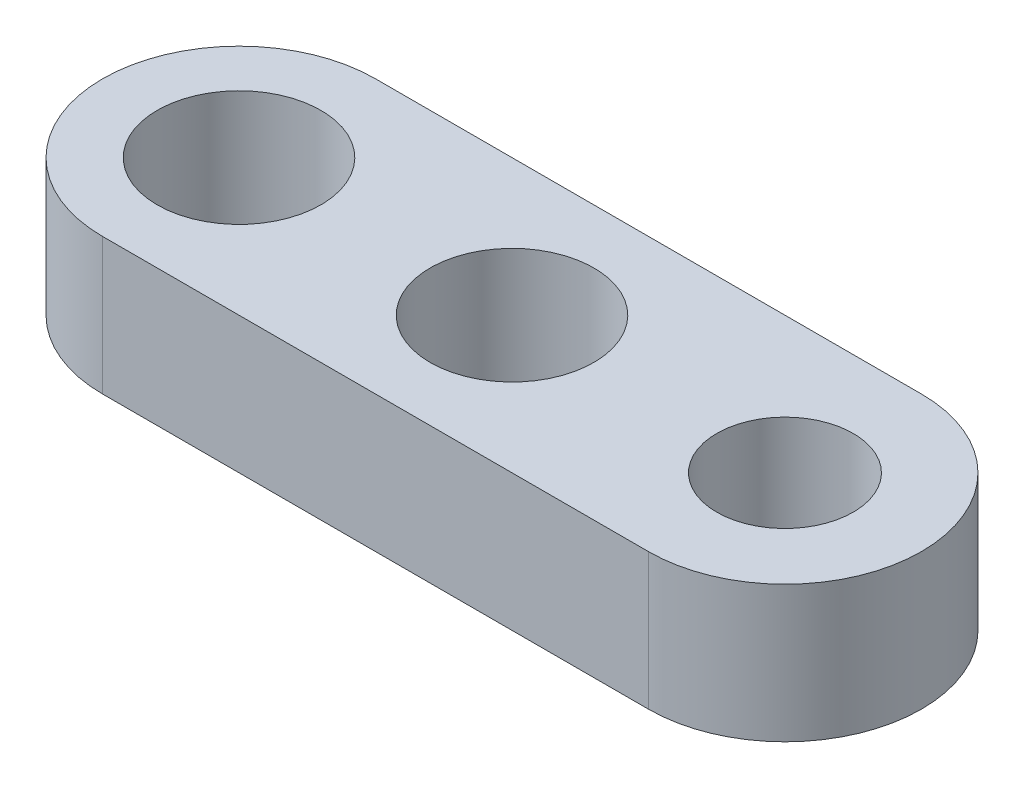
ISO-10303-21;
HEADER;
FILE_DESCRIPTION(('STEP AP214'),'2;1');
FILE_NAME('part.step','',(''),(''),'','','');
FILE_SCHEMA(('AUTOMOTIVE_DESIGN { 1 0 10303 214 1 1 1 1 }'));
ENDSEC;
DATA;
#1=APPLICATION_CONTEXT('core data for automotive mechanical design processes');
#2=APPLICATION_PROTOCOL_DEFINITION('international standard','automotive_design',2000,#1);
#3=PRODUCT_CONTEXT('',#1,'mechanical');
#4=PRODUCT('Part','Part','',(#3));
#5=PRODUCT_RELATED_PRODUCT_CATEGORY('part','',(#4));
#6=PRODUCT_DEFINITION_FORMATION('','',#4);
#7=PRODUCT_DEFINITION_CONTEXT('part definition',#1,'design');
#8=PRODUCT_DEFINITION('design','',#6,#7);
#9=PRODUCT_DEFINITION_SHAPE('','',#8);
#10=(LENGTH_UNIT() NAMED_UNIT(*) SI_UNIT(.MILLI.,.METRE.));
#11=(NAMED_UNIT(*) PLANE_ANGLE_UNIT() SI_UNIT($,.RADIAN.));
#12=(NAMED_UNIT(*) SI_UNIT($,.STERADIAN.) SOLID_ANGLE_UNIT());
#13=UNCERTAINTY_MEASURE_WITH_UNIT(LENGTH_MEASURE(1.E-05),#10,'distance_accuracy_value','');
#14=(GEOMETRIC_REPRESENTATION_CONTEXT(3) GLOBAL_UNCERTAINTY_ASSIGNED_CONTEXT((#13)) GLOBAL_UNIT_ASSIGNED_CONTEXT((#10,
#11,#12)) REPRESENTATION_CONTEXT('',''));
#15=CARTESIAN_POINT('',(0.,0.,0.));
#16=DIRECTION('',(0.,0.,1.));
#17=DIRECTION('',(1.,0.,0.));
#18=AXIS2_PLACEMENT_3D('',#15,#16,#17);
#19=CARTESIAN_POINT('',(0.,5.,0.));
#20=DIRECTION('',(0.,1.,0.));
#21=DIRECTION('',(0.,0.,1.));
#22=AXIS2_PLACEMENT_3D('',#19,#20,#21);
#23=PLANE('',#22);
#24=CARTESIAN_POINT('',(-20.,5.,0.));
#25=DIRECTION('',(0.,1.,0.));
#26=DIRECTION('',(0.,0.,1.));
#27=AXIS2_PLACEMENT_3D('',#24,#25,#26);
#28=CIRCLE('',#27,3.);
#29=CARTESIAN_POINT('',(-20.,5.,3.));
#30=VERTEX_POINT('',#29);
#31=EDGE_CURVE('E115',#30,#30,#28,.T.);
#32=ORIENTED_EDGE('',*,*,#31,.F.);
#33=EDGE_LOOP('',(#32));
#34=FACE_BOUND('',#33,.T.);
#35=CARTESIAN_POINT('',(0.,5.,0.));
#36=DIRECTION('',(0.,1.,0.));
#37=DIRECTION('',(0.,0.,1.));
#38=AXIS2_PLACEMENT_3D('',#35,#36,#37);
#39=CIRCLE('',#38,5.);
#40=CARTESIAN_POINT('',(0.,5.,5.));
#41=VERTEX_POINT('',#40);
#42=CARTESIAN_POINT('',(0.,5.,-5.));
#43=VERTEX_POINT('',#42);
#44=EDGE_CURVE('E85',#41,#43,#39,.T.);
#45=ORIENTED_EDGE('',*,*,#44,.T.);
#46=DIRECTION('',(-1.,0.,0.));
#47=VECTOR('',#46,1.);
#48=CARTESIAN_POINT('',(0.,5.,-5.));
#49=LINE('',#48,#47);
#50=CARTESIAN_POINT('',(-20.,5.,-5.));
#51=VERTEX_POINT('',#50);
#52=EDGE_CURVE('E80',#43,#51,#49,.T.);
#53=ORIENTED_EDGE('',*,*,#52,.T.);
#54=CARTESIAN_POINT('',(-20.,5.,0.));
#55=DIRECTION('',(0.,1.,0.));
#56=DIRECTION('',(0.,0.,1.));
#57=AXIS2_PLACEMENT_3D('',#54,#55,#56);
#58=CIRCLE('',#57,5.);
#59=CARTESIAN_POINT('',(-20.,5.,5.));
#60=VERTEX_POINT('',#59);
#61=EDGE_CURVE('E83',#51,#60,#58,.T.);
#62=ORIENTED_EDGE('',*,*,#61,.T.);
#63=DIRECTION('',(1.,0.,0.));
#64=VECTOR('',#63,1.);
#65=CARTESIAN_POINT('',(0.,5.,5.));
#66=LINE('',#65,#64);
#67=EDGE_CURVE('E50',#60,#41,#66,.T.);
#68=ORIENTED_EDGE('',*,*,#67,.T.);
#69=EDGE_LOOP('',(#45,#53,#62,#68));
#70=FACE_BOUND('',#69,.T.);
#71=CARTESIAN_POINT('',(0.,5.,0.));
#72=DIRECTION('',(0.,1.,0.));
#73=DIRECTION('',(0.,0.,1.));
#74=AXIS2_PLACEMENT_3D('',#71,#72,#73);
#75=CIRCLE('',#74,2.5);
#76=CARTESIAN_POINT('',(0.,5.,2.5));
#77=VERTEX_POINT('',#76);
#78=EDGE_CURVE('E100',#77,#77,#75,.T.);
#79=ORIENTED_EDGE('',*,*,#78,.F.);
#80=EDGE_LOOP('',(#79));
#81=FACE_BOUND('',#80,.T.);
#82=CARTESIAN_POINT('',(-10.,5.,0.));
#83=DIRECTION('',(0.,1.,0.));
#84=DIRECTION('',(0.,0.,1.));
#85=AXIS2_PLACEMENT_3D('',#82,#83,#84);
#86=CIRCLE('',#85,3.);
#87=CARTESIAN_POINT('',(-10.,5.,3.));
#88=VERTEX_POINT('',#87);
#89=EDGE_CURVE('E121',#88,#88,#86,.T.);
#90=ORIENTED_EDGE('',*,*,#89,.F.);
#91=EDGE_LOOP('',(#90));
#92=FACE_BOUND('',#91,.T.);
#93=ADVANCED_FACE('F33',(#34,#70,#81,#92),#23,.T.);
#94=CARTESIAN_POINT('',(0.,0.,0.));
#95=DIRECTION('',(0.,1.,0.));
#96=DIRECTION('',(0.,0.,1.));
#97=AXIS2_PLACEMENT_3D('',#94,#95,#96);
#98=PLANE('',#97);
#99=CARTESIAN_POINT('',(0.,0.,0.));
#100=DIRECTION('',(0.,1.,0.));
#101=DIRECTION('',(0.,0.,1.));
#102=AXIS2_PLACEMENT_3D('',#99,#100,#101);
#103=CIRCLE('',#102,5.);
#104=CARTESIAN_POINT('',(0.,0.,5.));
#105=VERTEX_POINT('',#104);
#106=CARTESIAN_POINT('',(0.,0.,-5.));
#107=VERTEX_POINT('',#106);
#108=EDGE_CURVE('E97',#105,#107,#103,.T.);
#109=ORIENTED_EDGE('',*,*,#108,.F.);
#110=DIRECTION('',(1.,0.,0.));
#111=VECTOR('',#110,1.);
#112=CARTESIAN_POINT('',(0.,0.,5.));
#113=LINE('',#112,#111);
#114=CARTESIAN_POINT('',(-20.,0.,5.));
#115=VERTEX_POINT('',#114);
#116=EDGE_CURVE('E73',#115,#105,#113,.T.);
#117=ORIENTED_EDGE('',*,*,#116,.F.);
#118=CARTESIAN_POINT('',(-20.,0.,0.));
#119=DIRECTION('',(0.,1.,0.));
#120=DIRECTION('',(0.,0.,1.));
#121=AXIS2_PLACEMENT_3D('',#118,#119,#120);
#122=CIRCLE('',#121,5.);
#123=CARTESIAN_POINT('',(-20.,0.,-5.));
#124=VERTEX_POINT('',#123);
#125=EDGE_CURVE('E67',#124,#115,#122,.T.);
#126=ORIENTED_EDGE('',*,*,#125,.F.);
#127=DIRECTION('',(-1.,0.,0.));
#128=VECTOR('',#127,1.);
#129=CARTESIAN_POINT('',(0.,0.,-5.));
#130=LINE('',#129,#128);
#131=EDGE_CURVE('E89',#107,#124,#130,.T.);
#132=ORIENTED_EDGE('',*,*,#131,.F.);
#133=EDGE_LOOP('',(#109,#117,#126,#132));
#134=FACE_BOUND('',#133,.T.);
#135=CARTESIAN_POINT('',(0.,0.,0.));
#136=DIRECTION('',(0.,1.,0.));
#137=DIRECTION('',(0.,0.,1.));
#138=AXIS2_PLACEMENT_3D('',#135,#136,#137);
#139=CIRCLE('',#138,2.5);
#140=CARTESIAN_POINT('',(0.,0.,2.5));
#141=VERTEX_POINT('',#140);
#142=EDGE_CURVE('E112',#141,#141,#139,.T.);
#143=ORIENTED_EDGE('',*,*,#142,.T.);
#144=EDGE_LOOP('',(#143));
#145=FACE_BOUND('',#144,.T.);
#146=CARTESIAN_POINT('',(-20.,0.,0.));
#147=DIRECTION('',(0.,1.,0.));
#148=DIRECTION('',(0.,0.,1.));
#149=AXIS2_PLACEMENT_3D('',#146,#147,#148);
#150=CIRCLE('',#149,3.);
#151=CARTESIAN_POINT('',(-20.,0.,3.));
#152=VERTEX_POINT('',#151);
#153=EDGE_CURVE('E118',#152,#152,#150,.T.);
#154=ORIENTED_EDGE('',*,*,#153,.T.);
#155=EDGE_LOOP('',(#154));
#156=FACE_BOUND('',#155,.T.);
#157=CARTESIAN_POINT('',(-10.,0.,0.));
#158=DIRECTION('',(0.,1.,0.));
#159=DIRECTION('',(0.,0.,1.));
#160=AXIS2_PLACEMENT_3D('',#157,#158,#159);
#161=CIRCLE('',#160,3.);
#162=CARTESIAN_POINT('',(-10.,0.,3.));
#163=VERTEX_POINT('',#162);
#164=EDGE_CURVE('E124',#163,#163,#161,.T.);
#165=ORIENTED_EDGE('',*,*,#164,.T.);
#166=EDGE_LOOP('',(#165));
#167=FACE_BOUND('',#166,.T.);
#168=ADVANCED_FACE('F108',(#134,#145,#156,#167),#98,.F.);
#169=CARTESIAN_POINT('',(0.,5.,0.));
#170=DIRECTION('',(0.,-1.,0.));
#171=DIRECTION('',(0.,0.,-1.));
#172=AXIS2_PLACEMENT_3D('',#169,#170,#171);
#173=CYLINDRICAL_SURFACE('',#172,5.);
#174=ORIENTED_EDGE('',*,*,#108,.T.);
#175=DIRECTION('',(0.,-1.,0.));
#176=VECTOR('',#175,1.);
#177=CARTESIAN_POINT('',(0.,5.,-5.));
#178=LINE('',#177,#176);
#179=EDGE_CURVE('E11',#43,#107,#178,.T.);
#180=ORIENTED_EDGE('',*,*,#179,.F.);
#181=ORIENTED_EDGE('',*,*,#44,.F.);
#182=DIRECTION('',(0.,-1.,0.));
#183=VECTOR('',#182,1.);
#184=CARTESIAN_POINT('',(0.,5.,5.));
#185=LINE('',#184,#183);
#186=EDGE_CURVE('E93',#41,#105,#185,.T.);
#187=ORIENTED_EDGE('',*,*,#186,.T.);
#188=EDGE_LOOP('',(#174,#180,#181,#187));
#189=FACE_BOUND('',#188,.T.);
#190=ADVANCED_FACE('F35',(#189),#173,.T.);
#191=CARTESIAN_POINT('',(0.,5.,-5.));
#192=DIRECTION('',(0.,0.,1.));
#193=DIRECTION('',(1.,0.,0.));
#194=AXIS2_PLACEMENT_3D('',#191,#192,#193);
#195=PLANE('',#194);
#196=ORIENTED_EDGE('',*,*,#131,.T.);
#197=DIRECTION('',(0.,-1.,0.));
#198=VECTOR('',#197,1.);
#199=CARTESIAN_POINT('',(-20.,5.,-5.));
#200=LINE('',#199,#198);
#201=EDGE_CURVE('E42',#51,#124,#200,.T.);
#202=ORIENTED_EDGE('',*,*,#201,.F.);
#203=ORIENTED_EDGE('',*,*,#52,.F.);
#204=ORIENTED_EDGE('',*,*,#179,.T.);
#205=EDGE_LOOP('',(#196,#202,#203,#204));
#206=FACE_BOUND('',#205,.T.);
#207=ADVANCED_FACE('F88',(#206),#195,.F.);
#208=CARTESIAN_POINT('',(-20.,5.,0.));
#209=DIRECTION('',(0.,-1.,0.));
#210=DIRECTION('',(0.,0.,-1.));
#211=AXIS2_PLACEMENT_3D('',#208,#209,#210);
#212=CYLINDRICAL_SURFACE('',#211,5.);
#213=ORIENTED_EDGE('',*,*,#125,.T.);
#214=DIRECTION('',(0.,-1.,0.));
#215=VECTOR('',#214,1.);
#216=CARTESIAN_POINT('',(-20.,5.,5.));
#217=LINE('',#216,#215);
#218=EDGE_CURVE('E90',#60,#115,#217,.T.);
#219=ORIENTED_EDGE('',*,*,#218,.F.);
#220=ORIENTED_EDGE('',*,*,#61,.F.);
#221=ORIENTED_EDGE('',*,*,#201,.T.);
#222=EDGE_LOOP('',(#213,#219,#220,#221));
#223=FACE_BOUND('',#222,.T.);
#224=ADVANCED_FACE('F91',(#223),#212,.T.);
#225=CARTESIAN_POINT('',(0.,5.,5.));
#226=DIRECTION('',(0.,0.,-1.));
#227=DIRECTION('',(-1.,0.,0.));
#228=AXIS2_PLACEMENT_3D('',#225,#226,#227);
#229=PLANE('',#228);
#230=ORIENTED_EDGE('',*,*,#116,.T.);
#231=ORIENTED_EDGE('',*,*,#186,.F.);
#232=ORIENTED_EDGE('',*,*,#67,.F.);
#233=ORIENTED_EDGE('',*,*,#218,.T.);
#234=EDGE_LOOP('',(#230,#231,#232,#233));
#235=FACE_BOUND('',#234,.T.);
#236=ADVANCED_FACE('F105',(#235),#229,.F.);
#237=CARTESIAN_POINT('',(0.,5.,0.));
#238=DIRECTION('',(0.,-1.,0.));
#239=DIRECTION('',(0.,0.,-1.));
#240=AXIS2_PLACEMENT_3D('',#237,#238,#239);
#241=CYLINDRICAL_SURFACE('',#240,2.5);
#242=ORIENTED_EDGE('',*,*,#78,.T.);
#243=EDGE_LOOP('',(#242));
#244=FACE_BOUND('',#243,.T.);
#245=ORIENTED_EDGE('',*,*,#142,.F.);
#246=EDGE_LOOP('',(#245));
#247=FACE_BOUND('',#246,.T.);
#248=ADVANCED_FACE('F142',(#244,#247),#241,.F.);
#249=CARTESIAN_POINT('',(-20.,5.,0.));
#250=DIRECTION('',(0.,-1.,0.));
#251=DIRECTION('',(0.,0.,-1.));
#252=AXIS2_PLACEMENT_3D('',#249,#250,#251);
#253=CYLINDRICAL_SURFACE('',#252,3.);
#254=ORIENTED_EDGE('',*,*,#31,.T.);
#255=EDGE_LOOP('',(#254));
#256=FACE_BOUND('',#255,.T.);
#257=ORIENTED_EDGE('',*,*,#153,.F.);
#258=EDGE_LOOP('',(#257));
#259=FACE_BOUND('',#258,.T.);
#260=ADVANCED_FACE('F188',(#256,#259),#253,.F.);
#261=CARTESIAN_POINT('',(-10.,5.,0.));
#262=DIRECTION('',(0.,-1.,0.));
#263=DIRECTION('',(0.,0.,-1.));
#264=AXIS2_PLACEMENT_3D('',#261,#262,#263);
#265=CYLINDRICAL_SURFACE('',#264,3.);
#266=ORIENTED_EDGE('',*,*,#89,.T.);
#267=EDGE_LOOP('',(#266));
#268=FACE_BOUND('',#267,.T.);
#269=ORIENTED_EDGE('',*,*,#164,.F.);
#270=EDGE_LOOP('',(#269));
#271=FACE_BOUND('',#270,.T.);
#272=ADVANCED_FACE('F130',(#268,#271),#265,.F.);
#273=CLOSED_SHELL('',(#93,#168,#190,#207,#224,#236,#248,#260,#272));
#274=MANIFOLD_SOLID_BREP('B2',#273);
#275=ADVANCED_BREP_SHAPE_REPRESENTATION('',(#18,#274),#14);
#276=SHAPE_DEFINITION_REPRESENTATION(#9,#275);
ENDSEC;
END-ISO-10303-21;
